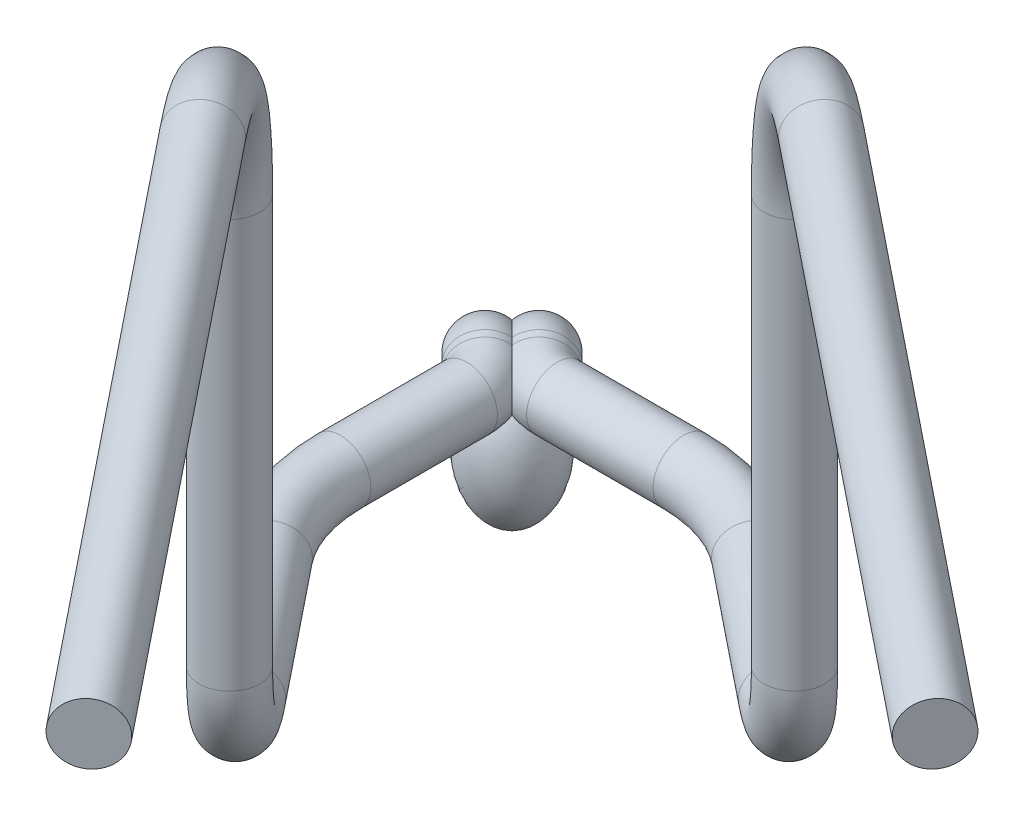
ISO-10303-21;
HEADER;
FILE_DESCRIPTION(('STEP AP214'),'2;1');
FILE_NAME('part.step','',(''),(''),'','','');
FILE_SCHEMA(('AUTOMOTIVE_DESIGN { 1 0 10303 214 1 1 1 1 }'));
ENDSEC;
DATA;
#1=APPLICATION_CONTEXT('core data for automotive mechanical design processes');
#2=APPLICATION_PROTOCOL_DEFINITION('international standard','automotive_design',2000,#1);
#3=PRODUCT_CONTEXT('',#1,'mechanical');
#4=PRODUCT('Part','Part','',(#3));
#5=PRODUCT_RELATED_PRODUCT_CATEGORY('part','',(#4));
#6=PRODUCT_DEFINITION_FORMATION('','',#4);
#7=PRODUCT_DEFINITION_CONTEXT('part definition',#1,'design');
#8=PRODUCT_DEFINITION('design','',#6,#7);
#9=PRODUCT_DEFINITION_SHAPE('','',#8);
#10=(LENGTH_UNIT() NAMED_UNIT(*) SI_UNIT(.MILLI.,.METRE.));
#11=(NAMED_UNIT(*) PLANE_ANGLE_UNIT() SI_UNIT($,.RADIAN.));
#12=(NAMED_UNIT(*) SI_UNIT($,.STERADIAN.) SOLID_ANGLE_UNIT());
#13=UNCERTAINTY_MEASURE_WITH_UNIT(LENGTH_MEASURE(1.E-05),#10,'distance_accuracy_value','');
#14=(GEOMETRIC_REPRESENTATION_CONTEXT(3) GLOBAL_UNCERTAINTY_ASSIGNED_CONTEXT((#13)) GLOBAL_UNIT_ASSIGNED_CONTEXT((#10,
#11,#12)) REPRESENTATION_CONTEXT('',''));
#15=CARTESIAN_POINT('',(0.,0.,0.));
#16=DIRECTION('',(0.,0.,1.));
#17=DIRECTION('',(1.,0.,0.));
#18=AXIS2_PLACEMENT_3D('',#15,#16,#17);
#19=CARTESIAN_POINT('',(-2.12132034355963,-1.17517821930275,-2.12132034355965));
#20=DIRECTION('',(-0.707106781186551,0.,0.707106781186544));
#21=DIRECTION('',(0.,-1.,0.));
#22=AXIS2_PLACEMENT_3D('',#19,#20,#21);
#23=ELLIPSE('',#22,0.75,0.5);
#24=TRIMMED_CURVE('',#23,(PARAMETER_VALUE(3.14159265358979)),
(PARAMETER_VALUE(6.28318530717959)),.T.,.PARAMETER.);
#25=CARTESIAN_POINT('',(-2.12132034355963,-0.425178219302746,-2.12132034355965));
#26=DIRECTION('',(0.,1.,0.));
#27=AXIS1_PLACEMENT('',#25,#26);
#28=SURFACE_OF_REVOLUTION('',#24,#27);
#29=CARTESIAN_POINT('',(-2.12132034355963,-1.92517821930275,-2.12132034355965));
#30=VERTEX_POINT('',#29);
#31=VERTEX_LOOP('',#30);
#32=FACE_BOUND('',#31,.T.);
#33=CARTESIAN_POINT('',(-2.12132034355963,-0.425178219302746,-2.12132034355965));
#34=VERTEX_POINT('',#33);
#35=VERTEX_LOOP('',#34);
#36=FACE_BOUND('',#35,.T.);
#37=ADVANCED_FACE('F44',(#32,#36),#28,.F.);
#38=CLOSED_SHELL('',(#37));
#39=MANIFOLD_SOLID_BREP('B2',#38);
#40=CARTESIAN_POINT('',(-2.27496458960672,-0.66558934653926,-1.96432519139862));
#41=DIRECTION('',(0.,1.,0.));
#42=DIRECTION('',(-0.707106781186552,0.,0.707106781186544));
#43=AXIS2_PLACEMENT_3D('',#40,#41,#42);
#44=PLANE('',#43);
#45=CARTESIAN_POINT('',(-2.27496458960672,-0.66558934653926,-1.96432519139862));
#46=DIRECTION('',(0.,-1.,0.));
#47=DIRECTION('',(-0.707106781186552,0.,0.707106781186544));
#48=AXIS2_PLACEMENT_3D('',#45,#46,#47);
#49=CIRCLE('',#48,0.350000000000001);
#50=CARTESIAN_POINT('',(-2.52245196302202,-0.66558934653926,-1.71683781798333));
#51=VERTEX_POINT('',#50);
#52=EDGE_CURVE('E84',#51,#51,#49,.T.);
#53=ORIENTED_EDGE('',*,*,#52,.T.);
#54=EDGE_LOOP('',(#53));
#55=FACE_BOUND('',#54,.T.);
#56=ADVANCED_FACE('F72',(#55),#44,.F.);
#57=CARTESIAN_POINT('',(7.15737940184408,7.68483910381432,12.009648162391));
#58=DIRECTION('',(0.625868258845886,0.,0.779928793268474));
#59=DIRECTION('',(-0.779928793268475,0.,0.625868258845886));
#60=AXIS2_PLACEMENT_3D('',#57,#58,#59);
#61=PLANE('',#60);
#62=CARTESIAN_POINT('',(7.15737940184408,7.68483910381432,12.009648162391));
#63=DIRECTION('',(-0.625868258845886,0.,-0.779928793268474));
#64=DIRECTION('',(-0.779928793268475,0.,0.625868258845886));
#65=AXIS2_PLACEMENT_3D('',#62,#63,#64);
#66=CIRCLE('',#65,0.350000000000001);
#67=CARTESIAN_POINT('',(6.88440432420011,7.68483910381432,12.2287020529871));
#68=VERTEX_POINT('',#67);
#69=EDGE_CURVE('E42',#68,#68,#66,.T.);
#70=ORIENTED_EDGE('',*,*,#69,.F.);
#71=EDGE_LOOP('',(#70));
#72=FACE_BOUND('',#71,.T.);
#73=ADVANCED_FACE('F90',(#72),#61,.T.);
#74=CARTESIAN_POINT('',(-2.27496458960672,-0.66558934653926,-1.96432519139862));
#75=DIRECTION('',(0.,1.,0.));
#76=DIRECTION('',(1.,0.,0.));
#77=AXIS2_PLACEMENT_3D('',#74,#75,#76);
#78=CYLINDRICAL_SURFACE('',#77,0.350000000000001);
#79=CARTESIAN_POINT('',(-2.27496458960672,-0.499999999999997,-1.96432519139862));
#80=DIRECTION('',(0.,-1.,0.));
#81=DIRECTION('',(-0.707106781186552,0.,0.707106781186544));
#82=AXIS2_PLACEMENT_3D('',#79,#80,#81);
#83=CIRCLE('',#82,0.350000000000001);
#84=CARTESIAN_POINT('',(-2.52245196302201,-0.499999999999995,-2.21181256481391));
#85=VERTEX_POINT('',#84);
#86=EDGE_CURVE('E145',#85,#85,#83,.T.);
#87=ORIENTED_EDGE('',*,*,#86,.T.);
#88=EDGE_LOOP('',(#87));
#89=FACE_BOUND('',#88,.T.);
#90=ORIENTED_EDGE('',*,*,#52,.F.);
#91=EDGE_LOOP('',(#90));
#92=FACE_BOUND('',#91,.T.);
#93=ADVANCED_FACE('F92',(#89,#92),#78,.T.);
#94=CARTESIAN_POINT('',(-1.92141119901345,-0.5,-1.61077180080534));
#95=DIRECTION('',(-0.707106781186552,0.,0.707106781186544));
#96=DIRECTION('',(-0.707106781186543,0.,-0.707106781186551));
#97=AXIS2_PLACEMENT_3D('',#94,#95,#96);
#98=TOROIDAL_SURFACE('',#97,0.5,0.350000000000001);
#99=CARTESIAN_POINT('',(-1.92141119901345,0.,-1.61077180080534));
#100=DIRECTION('',(-0.707106781186543,0.,-0.707106781186552));
#101=DIRECTION('',(-0.707106781186552,0.,0.707106781186543));
#102=AXIS2_PLACEMENT_3D('',#99,#100,#101);
#103=CIRCLE('',#102,0.350000000000001);
#104=CARTESIAN_POINT('',(-1.92141119901345,0.350000000000002,-1.61077180080534));
#105=VERTEX_POINT('',#104);
#106=EDGE_CURVE('E142',#105,#105,#103,.T.);
#107=CARTESIAN_POINT('',(-1.92141119901345,-0.5,-1.61077180080534));
#108=DIRECTION('',(-0.707106781186552,0.,0.707106781186544));
#109=DIRECTION('',(-0.707106781186543,0.,-0.707106781186551));
#110=AXIS2_PLACEMENT_3D('',#107,#108,#109);
#111=CIRCLE('',#110,0.850000000000001);
#112=EDGE_CURVE('',#105,#85,#111,.T.);
#113=ORIENTED_EDGE('',*,*,#106,.T.);
#114=ORIENTED_EDGE('',*,*,#86,.F.);
#115=ORIENTED_EDGE('',*,*,#112,.T.);
#116=ORIENTED_EDGE('',*,*,#112,.F.);
#117=EDGE_LOOP('',(#113,#115,#114,#116));
#118=FACE_BOUND('',#117,.T.);
#119=ADVANCED_FACE('F97',(#118),#98,.T.);
#120=CARTESIAN_POINT('',(-1.92141119901345,0.,-1.61077180080534));
#121=DIRECTION('',(0.707106781186544,0.,0.707106781186551));
#122=DIRECTION('',(-0.707106781186551,0.,0.707106781186544));
#123=AXIS2_PLACEMENT_3D('',#120,#121,#122);
#124=CYLINDRICAL_SURFACE('',#123,0.350000000000001);
#125=CARTESIAN_POINT('',(-1.84727725059833,0.,-1.53663785239021));
#126=DIRECTION('',(-0.707106781186544,0.,-0.707106781186551));
#127=DIRECTION('',(-0.707106781186551,0.,0.707106781186544));
#128=AXIS2_PLACEMENT_3D('',#125,#126,#127);
#129=CIRCLE('',#128,0.350000000000001);
#130=CARTESIAN_POINT('',(-1.59978987718303,0.,-1.7841252258055));
#131=VERTEX_POINT('',#130);
#132=EDGE_CURVE('E147',#131,#131,#129,.T.);
#133=ORIENTED_EDGE('',*,*,#132,.T.);
#134=EDGE_LOOP('',(#133));
#135=FACE_BOUND('',#134,.T.);
#136=ORIENTED_EDGE('',*,*,#106,.F.);
#137=EDGE_LOOP('',(#136));
#138=FACE_BOUND('',#137,.T.);
#139=ADVANCED_FACE('F130',(#135,#138),#124,.T.);
#140=CARTESIAN_POINT('',(-2.2008306411916,0.,-1.18308446179694));
#141=DIRECTION('',(0.,1.,0.));
#142=DIRECTION('',(1.,0.,0.));
#143=AXIS2_PLACEMENT_3D('',#140,#141,#142);
#144=TOROIDAL_SURFACE('',#143,0.499999999999998,0.350000000000001);
#145=CARTESIAN_POINT('',(-1.7008306411916,0.,-1.18308446179694));
#146=DIRECTION('',(0.,0.,-1.));
#147=DIRECTION('',(-1.,0.,0.));
#148=AXIS2_PLACEMENT_3D('',#145,#146,#147);
#149=CIRCLE('',#148,0.350000000000001);
#150=CARTESIAN_POINT('',(-1.3508306411916,0.,-1.18308446179693));
#151=VERTEX_POINT('',#150);
#152=EDGE_CURVE('E153',#151,#151,#149,.T.);
#153=CARTESIAN_POINT('',(-2.2008306411916,0.,-1.18308446179694));
#154=DIRECTION('',(0.,1.,0.));
#155=DIRECTION('',(1.,0.,0.));
#156=AXIS2_PLACEMENT_3D('',#153,#154,#155);
#157=CIRCLE('',#156,0.85);
#158=EDGE_CURVE('',#151,#131,#157,.T.);
#159=ORIENTED_EDGE('',*,*,#152,.T.);
#160=ORIENTED_EDGE('',*,*,#132,.F.);
#161=ORIENTED_EDGE('',*,*,#158,.T.);
#162=ORIENTED_EDGE('',*,*,#158,.F.);
#163=EDGE_LOOP('',(#159,#161,#160,#162));
#164=FACE_BOUND('',#163,.T.);
#165=ADVANCED_FACE('F126',(#164),#144,.T.);
#166=CARTESIAN_POINT('',(-1.7008306411916,0.,-1.18308446179693));
#167=DIRECTION('',(0.,0.,1.));
#168=DIRECTION('',(0.,1.,0.));
#169=AXIS2_PLACEMENT_3D('',#166,#167,#168);
#170=CYLINDRICAL_SURFACE('',#169,0.350000000000001);
#171=CARTESIAN_POINT('',(-1.70083064119162,0.,0.267695476696201));
#172=DIRECTION('',(0.,0.,-1.));
#173=DIRECTION('',(-1.,0.,0.));
#174=AXIS2_PLACEMENT_3D('',#171,#172,#173);
#175=CIRCLE('',#174,0.350000000000001);
#176=CARTESIAN_POINT('',(-2.05083064119162,0.,0.267695476696198));
#177=VERTEX_POINT('',#176);
#178=EDGE_CURVE('E156',#177,#177,#175,.T.);
#179=ORIENTED_EDGE('',*,*,#178,.T.);
#180=EDGE_LOOP('',(#179));
#181=FACE_BOUND('',#180,.T.);
#182=ORIENTED_EDGE('',*,*,#152,.F.);
#183=EDGE_LOOP('',(#182));
#184=FACE_BOUND('',#183,.T.);
#185=ADVANCED_FACE('F122',(#181,#184),#170,.T.);
#186=CARTESIAN_POINT('',(0.299169358808383,0.,0.267695476696217));
#187=DIRECTION('',(0.,-1.,0.));
#188=DIRECTION('',(-1.,0.,0.));
#189=AXIS2_PLACEMENT_3D('',#186,#187,#188);
#190=TOROIDAL_SURFACE('',#189,2.,0.350000000000001);
#191=CARTESIAN_POINT('',(-1.26068822772855,0.,1.51943199438798));
#192=DIRECTION('',(-0.625868258845886,0.,-0.779928793268474));
#193=DIRECTION('',(-0.779928793268475,0.,0.625868258845886));
#194=AXIS2_PLACEMENT_3D('',#191,#192,#193);
#195=CIRCLE('',#194,0.350000000000001);
#196=CARTESIAN_POINT('',(-1.53366330537254,0.,1.73848588498405));
#197=VERTEX_POINT('',#196);
#198=EDGE_CURVE('E159',#197,#197,#195,.T.);
#199=CARTESIAN_POINT('',(0.299169358808383,0.,0.267695476696217));
#200=DIRECTION('',(0.,-1.,0.));
#201=DIRECTION('',(-1.,0.,0.));
#202=AXIS2_PLACEMENT_3D('',#199,#200,#201);
#203=CIRCLE('',#202,2.35);
#204=EDGE_CURVE('',#197,#177,#203,.T.);
#205=ORIENTED_EDGE('',*,*,#198,.T.);
#206=ORIENTED_EDGE('',*,*,#178,.F.);
#207=ORIENTED_EDGE('',*,*,#204,.T.);
#208=ORIENTED_EDGE('',*,*,#204,.F.);
#209=EDGE_LOOP('',(#205,#207,#206,#208));
#210=FACE_BOUND('',#209,.T.);
#211=ADVANCED_FACE('F118',(#210),#190,.T.);
#212=CARTESIAN_POINT('',(-1.26068822772855,0.,1.51943199438798));
#213=DIRECTION('',(0.625868258845885,0.,0.779928793268475));
#214=DIRECTION('',(-0.779928793268476,0.,0.625868258845885));
#215=AXIS2_PLACEMENT_3D('',#212,#213,#214);
#216=CYLINDRICAL_SURFACE('',#215,0.350000000000001);
#217=CARTESIAN_POINT('',(-0.0179807133932658,0.,3.0680380442114));
#218=DIRECTION('',(-0.625868258845886,0.,-0.779928793268474));
#219=DIRECTION('',(-0.779928793268475,0.,0.625868258845886));
#220=AXIS2_PLACEMENT_3D('',#217,#218,#219);
#221=CIRCLE('',#220,0.350000000000001);
#222=CARTESIAN_POINT('',(-0.0179807133932646,-0.35,3.0680380442114));
#223=VERTEX_POINT('',#222);
#224=EDGE_CURVE('E162',#223,#223,#221,.T.);
#225=ORIENTED_EDGE('',*,*,#224,.T.);
#226=EDGE_LOOP('',(#225));
#227=FACE_BOUND('',#226,.T.);
#228=ORIENTED_EDGE('',*,*,#198,.F.);
#229=EDGE_LOOP('',(#228));
#230=FACE_BOUND('',#229,.T.);
#231=ADVANCED_FACE('F114',(#227,#230),#216,.T.);
#232=CARTESIAN_POINT('',(-0.0179807133932692,1.,3.0680380442114));
#233=DIRECTION('',(0.779928793268475,0.,-0.625868258845885));
#234=DIRECTION('',(0.625868258845885,0.,0.779928793268475));
#235=AXIS2_PLACEMENT_3D('',#232,#233,#234);
#236=TOROIDAL_SURFACE('',#235,0.999999999999999,0.350000000000001);
#237=CARTESIAN_POINT('',(0.607887545452602,1.,3.84796683747988));
#238=DIRECTION('',(0.,-1.,0.));
#239=DIRECTION('',(-0.779928793268476,0.,0.625868258845885));
#240=AXIS2_PLACEMENT_3D('',#237,#238,#239);
#241=CIRCLE('',#240,0.350000000000001);
#242=CARTESIAN_POINT('',(0.826941436048657,1.00000000000001,4.12094191512386));
#243=VERTEX_POINT('',#242);
#244=EDGE_CURVE('E165',#243,#243,#241,.T.);
#245=CARTESIAN_POINT('',(-0.0179807133932692,1.,3.0680380442114));
#246=DIRECTION('',(0.779928793268475,0.,-0.625868258845885));
#247=DIRECTION('',(0.625868258845885,0.,0.779928793268475));
#248=AXIS2_PLACEMENT_3D('',#245,#246,#247);
#249=CIRCLE('',#248,1.35);
#250=EDGE_CURVE('',#243,#223,#249,.T.);
#251=ORIENTED_EDGE('',*,*,#244,.T.);
#252=ORIENTED_EDGE('',*,*,#224,.F.);
#253=ORIENTED_EDGE('',*,*,#250,.T.);
#254=ORIENTED_EDGE('',*,*,#250,.F.);
#255=EDGE_LOOP('',(#251,#253,#252,#254));
#256=FACE_BOUND('',#255,.T.);
#257=ADVANCED_FACE('F110',(#256),#236,.T.);
#258=CARTESIAN_POINT('',(0.607887545452602,1.,3.84796683747988));
#259=DIRECTION('',(0.,1.,0.));
#260=DIRECTION('',(1.,0.,0.));
#261=AXIS2_PLACEMENT_3D('',#258,#259,#260);
#262=CYLINDRICAL_SURFACE('',#261,0.350000000000001);
#263=CARTESIAN_POINT('',(0.607887545452602,5.68483910381432,3.84796683747988));
#264=DIRECTION('',(0.,-1.,0.));
#265=DIRECTION('',(-0.779928793268476,0.,0.625868258845885));
#266=AXIS2_PLACEMENT_3D('',#263,#264,#265);
#267=CIRCLE('',#266,0.350000000000001);
#268=CARTESIAN_POINT('',(0.388833654856541,5.68483910381432,3.57499175983592));
#269=VERTEX_POINT('',#268);
#270=EDGE_CURVE('E168',#269,#269,#267,.T.);
#271=ORIENTED_EDGE('',*,*,#270,.T.);
#272=EDGE_LOOP('',(#271));
#273=FACE_BOUND('',#272,.T.);
#274=ORIENTED_EDGE('',*,*,#244,.F.);
#275=EDGE_LOOP('',(#274));
#276=FACE_BOUND('',#275,.T.);
#277=ADVANCED_FACE('F106',(#273,#276),#262,.T.);
#278=CARTESIAN_POINT('',(1.85962406314437,5.68483910381432,5.40782442401684));
#279=DIRECTION('',(-0.779928793268474,0.,0.625868258845886));
#280=DIRECTION('',(-0.625868258845886,0.,-0.779928793268474));
#281=AXIS2_PLACEMENT_3D('',#278,#279,#280);
#282=TOROIDAL_SURFACE('',#281,2.,0.350000000000001);
#283=CARTESIAN_POINT('',(1.85962406314437,7.68483910381432,5.40782442401684));
#284=DIRECTION('',(-0.625868258845886,0.,-0.779928793268474));
#285=DIRECTION('',(-0.779928793268475,0.,0.625868258845886));
#286=AXIS2_PLACEMENT_3D('',#283,#284,#285);
#287=CIRCLE('',#286,0.350000000000001);
#288=CARTESIAN_POINT('',(1.85962406314437,8.03483910381432,5.40782442401684));
#289=VERTEX_POINT('',#288);
#290=EDGE_CURVE('E79',#289,#289,#287,.T.);
#291=CARTESIAN_POINT('',(1.85962406314437,5.68483910381432,5.40782442401684));
#292=DIRECTION('',(-0.779928793268474,0.,0.625868258845886));
#293=DIRECTION('',(-0.625868258845886,0.,-0.779928793268474));
#294=AXIS2_PLACEMENT_3D('',#291,#292,#293);
#295=CIRCLE('',#294,2.35);
#296=EDGE_CURVE('',#289,#269,#295,.T.);
#297=ORIENTED_EDGE('',*,*,#290,.T.);
#298=ORIENTED_EDGE('',*,*,#270,.F.);
#299=ORIENTED_EDGE('',*,*,#296,.T.);
#300=ORIENTED_EDGE('',*,*,#296,.F.);
#301=EDGE_LOOP('',(#297,#299,#298,#300));
#302=FACE_BOUND('',#301,.T.);
#303=ADVANCED_FACE('F103',(#302),#282,.T.);
#304=CARTESIAN_POINT('',(1.85962406314437,7.68483910381432,5.40782442401684));
#305=DIRECTION('',(0.625868258845886,0.,0.779928793268474));
#306=DIRECTION('',(-0.779928793268475,0.,0.625868258845886));
#307=AXIS2_PLACEMENT_3D('',#304,#305,#306);
#308=CYLINDRICAL_SURFACE('',#307,0.350000000000001);
#309=ORIENTED_EDGE('',*,*,#69,.T.);
#310=EDGE_LOOP('',(#309));
#311=FACE_BOUND('',#310,.T.);
#312=ORIENTED_EDGE('',*,*,#290,.F.);
#313=EDGE_LOOP('',(#312));
#314=FACE_BOUND('',#313,.T.);
#315=ADVANCED_FACE('F87',(#311,#314),#308,.T.);
#316=CLOSED_SHELL('',(#56,#73,#93,#119,#139,#165,#185,#211,#231,#257,#277,#303,#315));
#317=MANIFOLD_SOLID_BREP('B6',#316);
#318=CARTESIAN_POINT('',(-1.96432519139859,-0.66558934653926,-2.27496458960675));
#319=DIRECTION('',(0.,1.,0.));
#320=DIRECTION('',(0.707106781186551,0.,-0.707106781186544));
#321=AXIS2_PLACEMENT_3D('',#318,#319,#320);
#322=PLANE('',#321);
#323=CARTESIAN_POINT('',(-1.96432519139859,-0.66558934653926,-2.27496458960675));
#324=DIRECTION('',(0.,1.,0.));
#325=DIRECTION('',(0.707106781186551,0.,-0.707106781186544));
#326=AXIS2_PLACEMENT_3D('',#323,#324,#325);
#327=CIRCLE('',#326,0.350000000000001);
#328=CARTESIAN_POINT('',(-1.7168378179833,-0.66558934653926,-2.52245196302204));
#329=VERTEX_POINT('',#328);
#330=EDGE_CURVE('E313',#329,#329,#327,.T.);
#331=ORIENTED_EDGE('',*,*,#330,.F.);
#332=EDGE_LOOP('',(#331));
#333=FACE_BOUND('',#332,.T.);
#334=ADVANCED_FACE('F301',(#333),#322,.F.);
#335=CARTESIAN_POINT('',(12.0096481623909,7.68483910381432,7.15737940184421));
#336=DIRECTION('',(0.779928793268468,0.,0.625868258845894));
#337=DIRECTION('',(0.625868258845894,0.,-0.779928793268468));
#338=AXIS2_PLACEMENT_3D('',#335,#336,#337);
#339=PLANE('',#338);
#340=CARTESIAN_POINT('',(12.0096481623909,7.68483910381432,7.15737940184421));
#341=DIRECTION('',(0.779928793268468,0.,0.625868258845894));
#342=DIRECTION('',(0.625868258845894,0.,-0.779928793268468));
#343=AXIS2_PLACEMENT_3D('',#340,#341,#342);
#344=CIRCLE('',#343,0.350000000000001);
#345=CARTESIAN_POINT('',(12.228702052987,7.68483910381432,6.88440432420025));
#346=VERTEX_POINT('',#345);
#347=EDGE_CURVE('E70',#346,#346,#344,.T.);
#348=ORIENTED_EDGE('',*,*,#347,.T.);
#349=EDGE_LOOP('',(#348));
#350=FACE_BOUND('',#349,.T.);
#351=ADVANCED_FACE('F316',(#350),#339,.T.);
#352=CARTESIAN_POINT('',(-1.96432519139859,-0.66558934653926,-2.27496458960675));
#353=DIRECTION('',(0.,1.,0.));
#354=DIRECTION('',(0.,0.,1.));
#355=AXIS2_PLACEMENT_3D('',#352,#353,#354);
#356=CYLINDRICAL_SURFACE('',#355,0.350000000000001);
#357=CARTESIAN_POINT('',(-1.96432519139859,-0.499999999999997,-2.27496458960675));
#358=DIRECTION('',(0.,1.,0.));
#359=DIRECTION('',(0.707106781186551,0.,-0.707106781186544));
#360=AXIS2_PLACEMENT_3D('',#357,#358,#359);
#361=CIRCLE('',#360,0.350000000000001);
#362=CARTESIAN_POINT('',(-2.21181256481388,-0.499999999999995,-2.52245196302204));
#363=VERTEX_POINT('',#362);
#364=EDGE_CURVE('E351',#363,#363,#361,.T.);
#365=ORIENTED_EDGE('',*,*,#364,.F.);
#366=EDGE_LOOP('',(#365));
#367=FACE_BOUND('',#366,.T.);
#368=ORIENTED_EDGE('',*,*,#330,.T.);
#369=EDGE_LOOP('',(#368));
#370=FACE_BOUND('',#369,.T.);
#371=ADVANCED_FACE('F355',(#367,#370),#356,.T.);
#372=CARTESIAN_POINT('',(-1.61077180080532,-0.5,-1.92141119901347));
#373=DIRECTION('',(0.707106781186551,0.,-0.707106781186544));
#374=DIRECTION('',(-0.707106781186544,0.,-0.707106781186551));
#375=AXIS2_PLACEMENT_3D('',#372,#373,#374);
#376=TOROIDAL_SURFACE('',#375,0.5,0.350000000000001);
#377=CARTESIAN_POINT('',(-1.61077180080532,0.,-1.92141119901347));
#378=DIRECTION('',(0.707106781186544,0.,0.707106781186551));
#379=DIRECTION('',(0.707106781186551,0.,-0.707106781186544));
#380=AXIS2_PLACEMENT_3D('',#377,#378,#379);
#381=CIRCLE('',#380,0.350000000000001);
#382=CARTESIAN_POINT('',(-1.61077180080532,0.350000000000002,-1.92141119901347));
#383=VERTEX_POINT('',#382);
#384=EDGE_CURVE('E348',#383,#383,#381,.T.);
#385=CARTESIAN_POINT('',(-1.61077180080532,-0.5,-1.92141119901347));
#386=DIRECTION('',(0.707106781186551,0.,-0.707106781186544));
#387=DIRECTION('',(-0.707106781186544,0.,-0.707106781186551));
#388=AXIS2_PLACEMENT_3D('',#385,#386,#387);
#389=CIRCLE('',#388,0.850000000000001);
#390=EDGE_CURVE('',#363,#383,#389,.T.);
#391=ORIENTED_EDGE('',*,*,#364,.T.);
#392=ORIENTED_EDGE('',*,*,#384,.F.);
#393=ORIENTED_EDGE('',*,*,#390,.T.);
#394=ORIENTED_EDGE('',*,*,#390,.F.);
#395=EDGE_LOOP('',(#391,#393,#392,#394));
#396=FACE_BOUND('',#395,.T.);
#397=ADVANCED_FACE('F357',(#396),#376,.T.);
#398=CARTESIAN_POINT('',(-1.61077180080532,0.,-1.92141119901347));
#399=DIRECTION('',(0.707106781186543,0.,0.707106781186552));
#400=DIRECTION('',(0.707106781186552,0.,-0.707106781186543));
#401=AXIS2_PLACEMENT_3D('',#398,#399,#400);
#402=CYLINDRICAL_SURFACE('',#401,0.350000000000001);
#403=CARTESIAN_POINT('',(-1.53663785239019,0.,-1.84727725059834));
#404=DIRECTION('',(0.707106781186543,0.,0.707106781186552));
#405=DIRECTION('',(0.707106781186552,0.,-0.707106781186543));
#406=AXIS2_PLACEMENT_3D('',#403,#404,#405);
#407=CIRCLE('',#406,0.350000000000001);
#408=CARTESIAN_POINT('',(-1.78412522580548,0.,-1.59978987718305));
#409=VERTEX_POINT('',#408);
#410=EDGE_CURVE('E345',#409,#409,#407,.T.);
#411=ORIENTED_EDGE('',*,*,#410,.F.);
#412=EDGE_LOOP('',(#411));
#413=FACE_BOUND('',#412,.T.);
#414=ORIENTED_EDGE('',*,*,#384,.T.);
#415=EDGE_LOOP('',(#414));
#416=FACE_BOUND('',#415,.T.);
#417=ADVANCED_FACE('F364',(#413,#416),#402,.T.);
#418=CARTESIAN_POINT('',(-1.18308446179692,0.,-2.20083064119161));
#419=DIRECTION('',(0.,1.,0.));
#420=DIRECTION('',(0.,0.,1.));
#421=AXIS2_PLACEMENT_3D('',#418,#419,#420);
#422=TOROIDAL_SURFACE('',#421,0.499999999999998,0.350000000000001);
#423=CARTESIAN_POINT('',(-1.18308446179692,0.,-1.70083064119162));
#424=DIRECTION('',(1.,0.,0.));
#425=DIRECTION('',(0.,0.,-1.));
#426=AXIS2_PLACEMENT_3D('',#423,#424,#425);
#427=CIRCLE('',#426,0.350000000000001);
#428=CARTESIAN_POINT('',(-1.18308446179692,0.,-1.35083064119161));
#429=VERTEX_POINT('',#428);
#430=EDGE_CURVE('E342',#429,#429,#427,.T.);
#431=CARTESIAN_POINT('',(-1.18308446179692,0.,-2.20083064119161));
#432=DIRECTION('',(0.,1.,0.));
#433=DIRECTION('',(0.,0.,1.));
#434=AXIS2_PLACEMENT_3D('',#431,#432,#433);
#435=CIRCLE('',#434,0.85);
#436=EDGE_CURVE('',#409,#429,#435,.T.);
#437=ORIENTED_EDGE('',*,*,#410,.T.);
#438=ORIENTED_EDGE('',*,*,#430,.F.);
#439=ORIENTED_EDGE('',*,*,#436,.T.);
#440=ORIENTED_EDGE('',*,*,#436,.F.);
#441=EDGE_LOOP('',(#437,#439,#438,#440));
#442=FACE_BOUND('',#441,.T.);
#443=ADVANCED_FACE('F371',(#442),#422,.T.);
#444=CARTESIAN_POINT('',(-1.18308446179692,0.,-1.70083064119162));
#445=DIRECTION('',(1.,0.,0.));
#446=DIRECTION('',(0.,1.,0.));
#447=AXIS2_PLACEMENT_3D('',#444,#445,#446);
#448=CYLINDRICAL_SURFACE('',#447,0.350000000000001);
#449=CARTESIAN_POINT('',(0.267695476696219,0.,-1.70083064119162));
#450=DIRECTION('',(1.,0.,0.));
#451=DIRECTION('',(0.,0.,-1.));
#452=AXIS2_PLACEMENT_3D('',#449,#450,#451);
#453=CIRCLE('',#452,0.350000000000001);
#454=CARTESIAN_POINT('',(0.26769547669622,0.,-2.05083064119162));
#455=VERTEX_POINT('',#454);
#456=EDGE_CURVE('E339',#455,#455,#453,.T.);
#457=ORIENTED_EDGE('',*,*,#456,.F.);
#458=EDGE_LOOP('',(#457));
#459=FACE_BOUND('',#458,.T.);
#460=ORIENTED_EDGE('',*,*,#430,.T.);
#461=EDGE_LOOP('',(#460));
#462=FACE_BOUND('',#461,.T.);
#463=ADVANCED_FACE('F375',(#459,#462),#448,.T.);
#464=CARTESIAN_POINT('',(0.267695476696214,0.,0.299169358808386));
#465=DIRECTION('',(0.,-1.,0.));
#466=DIRECTION('',(0.,0.,-1.));
#467=AXIS2_PLACEMENT_3D('',#464,#465,#466);
#468=TOROIDAL_SURFACE('',#467,2.,0.350000000000001);
#469=CARTESIAN_POINT('',(1.51943199438799,0.,-1.26068822772854));
#470=DIRECTION('',(0.779928793268468,0.,0.625868258845894));
#471=DIRECTION('',(0.625868258845894,0.,-0.779928793268468));
#472=AXIS2_PLACEMENT_3D('',#469,#470,#471);
#473=CIRCLE('',#472,0.350000000000001);
#474=CARTESIAN_POINT('',(1.73848588498407,0.,-1.53366330537252));
#475=VERTEX_POINT('',#474);
#476=EDGE_CURVE('E336',#475,#475,#473,.T.);
#477=CARTESIAN_POINT('',(0.267695476696214,0.,0.299169358808386));
#478=DIRECTION('',(0.,-1.,0.));
#479=DIRECTION('',(0.,0.,-1.));
#480=AXIS2_PLACEMENT_3D('',#477,#478,#479);
#481=CIRCLE('',#480,2.35);
#482=EDGE_CURVE('',#455,#475,#481,.T.);
#483=ORIENTED_EDGE('',*,*,#456,.T.);
#484=ORIENTED_EDGE('',*,*,#476,.F.);
#485=ORIENTED_EDGE('',*,*,#482,.T.);
#486=ORIENTED_EDGE('',*,*,#482,.F.);
#487=EDGE_LOOP('',(#483,#485,#484,#486));
#488=FACE_BOUND('',#487,.T.);
#489=ADVANCED_FACE('F379',(#488),#468,.T.);
#490=CARTESIAN_POINT('',(1.519431994388,0.,-1.26068822772854));
#491=DIRECTION('',(0.779928793268469,0.,0.625868258845893));
#492=DIRECTION('',(0.625868258845893,0.,-0.779928793268469));
#493=AXIS2_PLACEMENT_3D('',#490,#491,#492);
#494=CYLINDRICAL_SURFACE('',#493,0.350000000000001);
#495=CARTESIAN_POINT('',(3.0680380442114,0.,-0.0179807133932324));
#496=DIRECTION('',(0.779928793268468,0.,0.625868258845894));
#497=DIRECTION('',(0.625868258845894,0.,-0.779928793268468));
#498=AXIS2_PLACEMENT_3D('',#495,#496,#497);
#499=CIRCLE('',#498,0.350000000000001);
#500=CARTESIAN_POINT('',(3.0680380442114,-0.35,-0.0179807133932312));
#501=VERTEX_POINT('',#500);
#502=EDGE_CURVE('E333',#501,#501,#499,.T.);
#503=ORIENTED_EDGE('',*,*,#502,.F.);
#504=EDGE_LOOP('',(#503));
#505=FACE_BOUND('',#504,.T.);
#506=ORIENTED_EDGE('',*,*,#476,.T.);
#507=EDGE_LOOP('',(#506));
#508=FACE_BOUND('',#507,.T.);
#509=ADVANCED_FACE('F383',(#505,#508),#494,.T.);
#510=CARTESIAN_POINT('',(3.0680380442114,1.,-0.0179807133932358));
#511=DIRECTION('',(-0.625868258845893,0.,0.779928793268469));
#512=DIRECTION('',(0.779928793268469,0.,0.625868258845893));
#513=AXIS2_PLACEMENT_3D('',#510,#511,#512);
#514=TOROIDAL_SURFACE('',#513,0.999999999999999,0.350000000000001);
#515=CARTESIAN_POINT('',(3.84796683747988,1.,0.607887545452644));
#516=DIRECTION('',(0.,1.,0.));
#517=DIRECTION('',(0.625868258845894,0.,-0.779928793268469));
#518=AXIS2_PLACEMENT_3D('',#515,#516,#517);
#519=CIRCLE('',#518,0.350000000000001);
#520=CARTESIAN_POINT('',(4.12094191512385,1.00000000000001,0.826941436048701));
#521=VERTEX_POINT('',#520);
#522=EDGE_CURVE('E328',#521,#521,#519,.T.);
#523=CARTESIAN_POINT('',(3.0680380442114,1.,-0.0179807133932358));
#524=DIRECTION('',(-0.625868258845893,0.,0.779928793268469));
#525=DIRECTION('',(0.779928793268469,0.,0.625868258845893));
#526=AXIS2_PLACEMENT_3D('',#523,#524,#525);
#527=CIRCLE('',#526,1.35);
#528=EDGE_CURVE('',#501,#521,#527,.T.);
#529=ORIENTED_EDGE('',*,*,#502,.T.);
#530=ORIENTED_EDGE('',*,*,#522,.F.);
#531=ORIENTED_EDGE('',*,*,#528,.T.);
#532=ORIENTED_EDGE('',*,*,#528,.F.);
#533=EDGE_LOOP('',(#529,#531,#530,#532));
#534=FACE_BOUND('',#533,.T.);
#535=ADVANCED_FACE('F387',(#534),#514,.T.);
#536=CARTESIAN_POINT('',(3.84796683747988,1.,0.607887545452644));
#537=DIRECTION('',(0.,1.,0.));
#538=DIRECTION('',(0.,0.,1.));
#539=AXIS2_PLACEMENT_3D('',#536,#537,#538);
#540=CYLINDRICAL_SURFACE('',#539,0.350000000000001);
#541=CARTESIAN_POINT('',(3.84796683747988,5.68483910381432,0.607887545452644));
#542=DIRECTION('',(0.,1.,0.));
#543=DIRECTION('',(0.625868258845894,0.,-0.779928793268469));
#544=AXIS2_PLACEMENT_3D('',#541,#542,#543);
#545=CIRCLE('',#544,0.350000000000001);
#546=CARTESIAN_POINT('',(3.57499175983591,5.68483910381432,0.388833654856579));
#547=VERTEX_POINT('',#546);
#548=EDGE_CURVE('E326',#547,#547,#545,.T.);
#549=ORIENTED_EDGE('',*,*,#548,.F.);
#550=EDGE_LOOP('',(#549));
#551=FACE_BOUND('',#550,.T.);
#552=ORIENTED_EDGE('',*,*,#522,.T.);
#553=EDGE_LOOP('',(#552));
#554=FACE_BOUND('',#553,.T.);
#555=ADVANCED_FACE('F391',(#551,#554),#540,.T.);
#556=CARTESIAN_POINT('',(5.40782442401682,5.68483910381432,1.85962406314443));
#557=DIRECTION('',(0.625868258845895,0.,-0.779928793268468));
#558=DIRECTION('',(-0.779928793268468,0.,-0.625868258845895));
#559=AXIS2_PLACEMENT_3D('',#556,#557,#558);
#560=TOROIDAL_SURFACE('',#559,2.,0.350000000000001);
#561=CARTESIAN_POINT('',(5.40782442401682,7.68483910381432,1.85962406314443));
#562=DIRECTION('',(0.779928793268468,0.,0.625868258845894));
#563=DIRECTION('',(0.625868258845894,0.,-0.779928793268468));
#564=AXIS2_PLACEMENT_3D('',#561,#562,#563);
#565=CIRCLE('',#564,0.350000000000001);
#566=CARTESIAN_POINT('',(5.40782442401682,8.03483910381432,1.85962406314443));
#567=VERTEX_POINT('',#566);
#568=EDGE_CURVE('E308',#567,#567,#565,.T.);
#569=CARTESIAN_POINT('',(5.40782442401682,5.68483910381432,1.85962406314443));
#570=DIRECTION('',(0.625868258845895,0.,-0.779928793268468));
#571=DIRECTION('',(-0.779928793268468,0.,-0.625868258845895));
#572=AXIS2_PLACEMENT_3D('',#569,#570,#571);
#573=CIRCLE('',#572,2.35);
#574=EDGE_CURVE('',#547,#567,#573,.T.);
#575=ORIENTED_EDGE('',*,*,#548,.T.);
#576=ORIENTED_EDGE('',*,*,#568,.F.);
#577=ORIENTED_EDGE('',*,*,#574,.T.);
#578=ORIENTED_EDGE('',*,*,#574,.F.);
#579=EDGE_LOOP('',(#575,#577,#576,#578));
#580=FACE_BOUND('',#579,.T.);
#581=ADVANCED_FACE('F321',(#580),#560,.T.);
#582=CARTESIAN_POINT('',(5.40782442401682,7.68483910381432,1.85962406314443));
#583=DIRECTION('',(0.779928793268468,0.,0.625868258845894));
#584=DIRECTION('',(0.625868258845895,0.,-0.779928793268468));
#585=AXIS2_PLACEMENT_3D('',#582,#583,#584);
#586=CYLINDRICAL_SURFACE('',#585,0.350000000000001);
#587=ORIENTED_EDGE('',*,*,#347,.F.);
#588=EDGE_LOOP('',(#587));
#589=FACE_BOUND('',#588,.T.);
#590=ORIENTED_EDGE('',*,*,#568,.T.);
#591=EDGE_LOOP('',(#590));
#592=FACE_BOUND('',#591,.T.);
#593=ADVANCED_FACE('F318',(#589,#592),#586,.T.);
#594=CLOSED_SHELL('',(#334,#351,#371,#397,#417,#443,#463,#489,#509,#535,#555,#581,#593));
#595=MANIFOLD_SOLID_BREP('B36',#594);
#596=ADVANCED_BREP_SHAPE_REPRESENTATION('',(#18,#39,#317,#595),#14);
#597=SHAPE_DEFINITION_REPRESENTATION(#9,#596);
ENDSEC;
END-ISO-10303-21;
